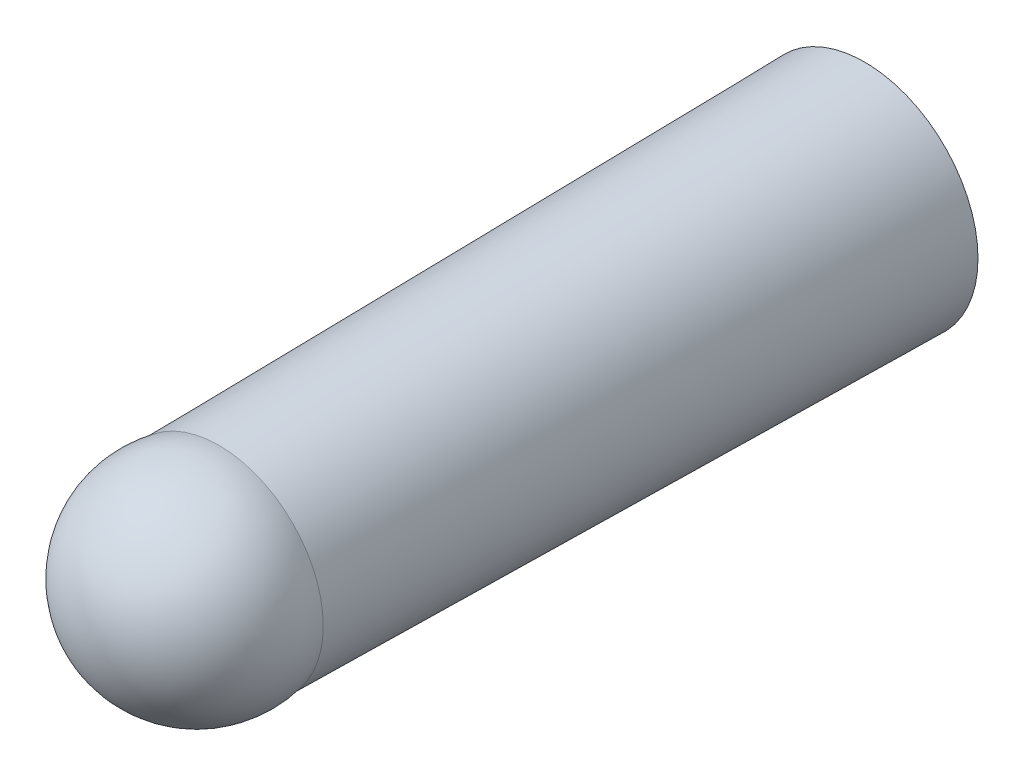
ISO-10303-21;
HEADER;
FILE_DESCRIPTION(('STEP AP214'),'2;1');
FILE_NAME('part.step','',(''),(''),'','','');
FILE_SCHEMA(('AUTOMOTIVE_DESIGN { 1 0 10303 214 1 1 1 1 }'));
ENDSEC;
DATA;
#1=APPLICATION_CONTEXT('core data for automotive mechanical design processes');
#2=APPLICATION_PROTOCOL_DEFINITION('international standard','automotive_design',2000,#1);
#3=PRODUCT_CONTEXT('',#1,'mechanical');
#4=PRODUCT('Part','Part','',(#3));
#5=PRODUCT_RELATED_PRODUCT_CATEGORY('part','',(#4));
#6=PRODUCT_DEFINITION_FORMATION('','',#4);
#7=PRODUCT_DEFINITION_CONTEXT('part definition',#1,'design');
#8=PRODUCT_DEFINITION('design','',#6,#7);
#9=PRODUCT_DEFINITION_SHAPE('','',#8);
#10=(LENGTH_UNIT() NAMED_UNIT(*) SI_UNIT(.MILLI.,.METRE.));
#11=(NAMED_UNIT(*) PLANE_ANGLE_UNIT() SI_UNIT($,.RADIAN.));
#12=(NAMED_UNIT(*) SI_UNIT($,.STERADIAN.) SOLID_ANGLE_UNIT());
#13=UNCERTAINTY_MEASURE_WITH_UNIT(LENGTH_MEASURE(1.E-05),#10,'distance_accuracy_value','');
#14=(GEOMETRIC_REPRESENTATION_CONTEXT(3) GLOBAL_UNCERTAINTY_ASSIGNED_CONTEXT((#13)) GLOBAL_UNIT_ASSIGNED_CONTEXT((#10,
#11,#12)) REPRESENTATION_CONTEXT('',''));
#15=CARTESIAN_POINT('',(0.,0.,0.));
#16=DIRECTION('',(0.,0.,1.));
#17=DIRECTION('',(1.,0.,0.));
#18=AXIS2_PLACEMENT_3D('',#15,#16,#17);
#19=CARTESIAN_POINT('',(0.,0.,0.));
#20=DIRECTION('',(0.,0.,-1.));
#21=DIRECTION('',(1.,0.,0.));
#22=AXIS2_PLACEMENT_3D('',#19,#20,#21);
#23=CONICAL_SURFACE('',#22,47.5,0.0139626340159547);
#24=CARTESIAN_POINT('',(0.,0.,270.659345250483));
#25=DIRECTION('',(0.,0.,1.));
#26=DIRECTION('',(1.,0.,0.));
#27=AXIS2_PLACEMENT_3D('',#24,#25,#26);
#28=CIRCLE('',#27,43.7206370139865);
#29=CARTESIAN_POINT('',(43.7206370139865,0.,270.659345250483));
#30=VERTEX_POINT('',#29);
#31=EDGE_CURVE('E35',#30,#30,#28,.F.);
#32=ORIENTED_EDGE('',*,*,#31,.T.);
#33=EDGE_LOOP('',(#32));
#34=FACE_BOUND('',#33,.T.);
#35=CARTESIAN_POINT('',(0.,0.,0.));
#36=DIRECTION('',(0.,0.,1.));
#37=DIRECTION('',(1.,0.,0.));
#38=AXIS2_PLACEMENT_3D('',#35,#36,#37);
#39=CIRCLE('',#38,47.5);
#40=CARTESIAN_POINT('',(47.5,0.,0.));
#41=VERTEX_POINT('',#40);
#42=EDGE_CURVE('E10',#41,#41,#39,.T.);
#43=ORIENTED_EDGE('',*,*,#42,.T.);
#44=EDGE_LOOP('',(#43));
#45=FACE_BOUND('',#44,.T.);
#46=ADVANCED_FACE('F32',(#34,#45),#23,.T.);
#47=CARTESIAN_POINT('',(0.,0.,0.));
#48=DIRECTION('',(0.,0.,1.));
#49=DIRECTION('',(1.,0.,0.));
#50=AXIS2_PLACEMENT_3D('',#47,#48,#49);
#51=PLANE('',#50);
#52=CARTESIAN_POINT('',(0.,0.,0.));
#53=DIRECTION('',(0.,0.,1.));
#54=DIRECTION('',(1.,0.,0.));
#55=AXIS2_PLACEMENT_3D('',#52,#53,#54);
#56=CIRCLE('',#55,42.5);
#57=CARTESIAN_POINT('',(42.5,0.,0.));
#58=VERTEX_POINT('',#57);
#59=EDGE_CURVE('E39',#58,#58,#56,.F.);
#60=ORIENTED_EDGE('',*,*,#59,.F.);
#61=EDGE_LOOP('',(#60));
#62=FACE_BOUND('',#61,.T.);
#63=ORIENTED_EDGE('',*,*,#42,.F.);
#64=EDGE_LOOP('',(#63));
#65=FACE_BOUND('',#64,.T.);
#66=ADVANCED_FACE('F57',(#62,#65),#51,.F.);
#67=CARTESIAN_POINT('',(0.,0.,0.));
#68=DIRECTION('',(0.,1.,0.));
#69=DIRECTION('',(-1.,0.,0.));
#70=AXIS2_PLACEMENT_3D('',#67,#68,#69);
#71=SPHERICAL_SURFACE('',#70,42.5);
#72=CARTESIAN_POINT('',(0.,0.,0.));
#73=DIRECTION('',(0.,0.,1.));
#74=DIRECTION('',(1.,0.,0.));
#75=AXIS2_PLACEMENT_3D('',#72,#73,#74);
#76=SPHERICAL_SURFACE('',#75,42.5);
#77=ORIENTED_EDGE('',*,*,#59,.T.);
#78=EDGE_LOOP('',(#77));
#79=FACE_BOUND('',#78,.T.);
#80=ADVANCED_FACE('F52',(#79),#76,.F.);
#81=CARTESIAN_POINT('',(0.,0.,280.));
#82=DIRECTION('',(0.,1.,0.));
#83=DIRECTION('',(1.,0.,0.));
#84=AXIS2_PLACEMENT_3D('',#81,#82,#83);
#85=SPHERICAL_SURFACE('',#84,44.7072917101637);
#86=CARTESIAN_POINT('',(0.,0.,280.));
#87=DIRECTION('',(0.,0.,1.));
#88=DIRECTION('',(1.,0.,0.));
#89=AXIS2_PLACEMENT_3D('',#86,#87,#88);
#90=SPHERICAL_SURFACE('',#89,44.7072917101637);
#91=ORIENTED_EDGE('',*,*,#31,.F.);
#92=EDGE_LOOP('',(#91));
#93=FACE_BOUND('',#92,.T.);
#94=ADVANCED_FACE('F50',(#93),#90,.T.);
#95=CLOSED_SHELL('',(#46,#66,#80,#94));
#96=MANIFOLD_SOLID_BREP('B2',#95);
#97=ADVANCED_BREP_SHAPE_REPRESENTATION('',(#18,#96),#14);
#98=SHAPE_DEFINITION_REPRESENTATION(#9,#97);
ENDSEC;
END-ISO-10303-21;
